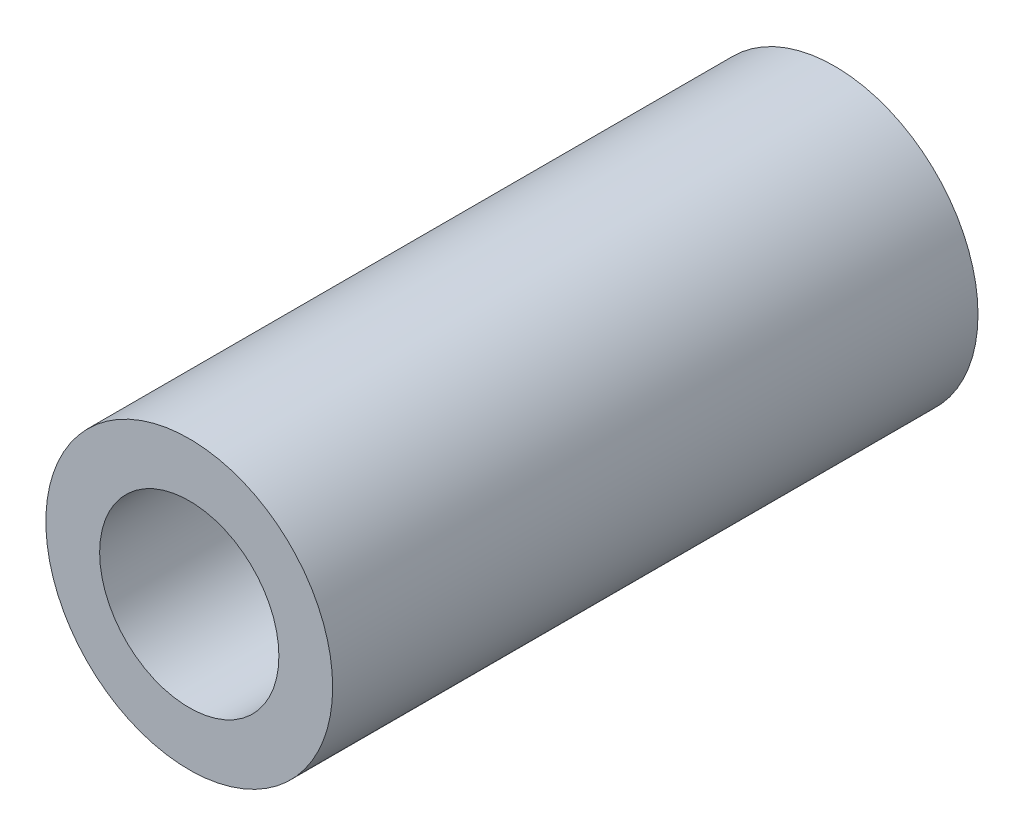
ISO-10303-21;
HEADER;
FILE_DESCRIPTION(('STEP AP214'),'2;1');
FILE_NAME('part.step','',(''),(''),'','','');
FILE_SCHEMA(('AUTOMOTIVE_DESIGN { 1 0 10303 214 1 1 1 1 }'));
ENDSEC;
DATA;
#1=APPLICATION_CONTEXT('core data for automotive mechanical design processes');
#2=APPLICATION_PROTOCOL_DEFINITION('international standard','automotive_design',2000,#1);
#3=PRODUCT_CONTEXT('',#1,'mechanical');
#4=PRODUCT('Part','Part','',(#3));
#5=PRODUCT_RELATED_PRODUCT_CATEGORY('part','',(#4));
#6=PRODUCT_DEFINITION_FORMATION('','',#4);
#7=PRODUCT_DEFINITION_CONTEXT('part definition',#1,'design');
#8=PRODUCT_DEFINITION('design','',#6,#7);
#9=PRODUCT_DEFINITION_SHAPE('','',#8);
#10=(LENGTH_UNIT() NAMED_UNIT(*) SI_UNIT(.MILLI.,.METRE.));
#11=(NAMED_UNIT(*) PLANE_ANGLE_UNIT() SI_UNIT($,.RADIAN.));
#12=(NAMED_UNIT(*) SI_UNIT($,.STERADIAN.) SOLID_ANGLE_UNIT());
#13=UNCERTAINTY_MEASURE_WITH_UNIT(LENGTH_MEASURE(1.E-05),#10,'distance_accuracy_value','');
#14=(GEOMETRIC_REPRESENTATION_CONTEXT(3) GLOBAL_UNCERTAINTY_ASSIGNED_CONTEXT((#13)) GLOBAL_UNIT_ASSIGNED_CONTEXT((#10,
#11,#12)) REPRESENTATION_CONTEXT('',''));
#15=CARTESIAN_POINT('',(0.,0.,0.));
#16=DIRECTION('',(0.,0.,1.));
#17=DIRECTION('',(1.,0.,0.));
#18=AXIS2_PLACEMENT_3D('',#15,#16,#17);
#19=CARTESIAN_POINT('',(0.,0.,18.));
#20=DIRECTION('',(0.,0.,1.));
#21=DIRECTION('',(1.,0.,0.));
#22=AXIS2_PLACEMENT_3D('',#19,#20,#21);
#23=PLANE('',#22);
#24=CARTESIAN_POINT('',(0.,0.,18.));
#25=DIRECTION('',(0.,0.,1.));
#26=DIRECTION('',(1.,0.,0.));
#27=AXIS2_PLACEMENT_3D('',#24,#25,#26);
#28=CIRCLE('',#27,4.);
#29=CARTESIAN_POINT('',(4.,0.,18.));
#30=VERTEX_POINT('',#29);
#31=EDGE_CURVE('E10',#30,#30,#28,.T.);
#32=ORIENTED_EDGE('',*,*,#31,.T.);
#33=EDGE_LOOP('',(#32));
#34=FACE_BOUND('',#33,.T.);
#35=CARTESIAN_POINT('',(0.,0.,18.));
#36=DIRECTION('',(0.,0.,1.));
#37=DIRECTION('',(1.,0.,0.));
#38=AXIS2_PLACEMENT_3D('',#35,#36,#37);
#39=CIRCLE('',#38,2.5);
#40=CARTESIAN_POINT('',(2.5,0.,18.));
#41=VERTEX_POINT('',#40);
#42=EDGE_CURVE('E56',#41,#41,#39,.T.);
#43=ORIENTED_EDGE('',*,*,#42,.F.);
#44=EDGE_LOOP('',(#43));
#45=FACE_BOUND('',#44,.T.);
#46=ADVANCED_FACE('F43',(#34,#45),#23,.T.);
#47=CARTESIAN_POINT('',(0.,0.,0.));
#48=DIRECTION('',(0.,0.,1.));
#49=DIRECTION('',(1.,0.,0.));
#50=AXIS2_PLACEMENT_3D('',#47,#48,#49);
#51=PLANE('',#50);
#52=CARTESIAN_POINT('',(0.,0.,0.));
#53=DIRECTION('',(0.,0.,1.));
#54=DIRECTION('',(1.,0.,0.));
#55=AXIS2_PLACEMENT_3D('',#52,#53,#54);
#56=CIRCLE('',#55,4.);
#57=CARTESIAN_POINT('',(4.,0.,0.));
#58=VERTEX_POINT('',#57);
#59=EDGE_CURVE('E47',#58,#58,#56,.T.);
#60=ORIENTED_EDGE('',*,*,#59,.F.);
#61=EDGE_LOOP('',(#60));
#62=FACE_BOUND('',#61,.T.);
#63=CARTESIAN_POINT('',(0.,0.,0.));
#64=DIRECTION('',(0.,0.,1.));
#65=DIRECTION('',(1.,0.,0.));
#66=AXIS2_PLACEMENT_3D('',#63,#64,#65);
#67=CIRCLE('',#66,2.5);
#68=CARTESIAN_POINT('',(2.5,0.,0.));
#69=VERTEX_POINT('',#68);
#70=EDGE_CURVE('E58',#69,#69,#67,.T.);
#71=ORIENTED_EDGE('',*,*,#70,.T.);
#72=EDGE_LOOP('',(#71));
#73=FACE_BOUND('',#72,.T.);
#74=ADVANCED_FACE('F70',(#62,#73),#51,.F.);
#75=CARTESIAN_POINT('',(0.,0.,18.));
#76=DIRECTION('',(0.,0.,-1.));
#77=DIRECTION('',(-1.,0.,0.));
#78=AXIS2_PLACEMENT_3D('',#75,#76,#77);
#79=CYLINDRICAL_SURFACE('',#78,4.);
#80=ORIENTED_EDGE('',*,*,#31,.F.);
#81=EDGE_LOOP('',(#80));
#82=FACE_BOUND('',#81,.T.);
#83=ORIENTED_EDGE('',*,*,#59,.T.);
#84=EDGE_LOOP('',(#83));
#85=FACE_BOUND('',#84,.T.);
#86=ADVANCED_FACE('F45',(#82,#85),#79,.T.);
#87=CARTESIAN_POINT('',(0.,0.,18.));
#88=DIRECTION('',(0.,0.,-1.));
#89=DIRECTION('',(-1.,0.,0.));
#90=AXIS2_PLACEMENT_3D('',#87,#88,#89);
#91=CYLINDRICAL_SURFACE('',#90,2.5);
#92=ORIENTED_EDGE('',*,*,#42,.T.);
#93=EDGE_LOOP('',(#92));
#94=FACE_BOUND('',#93,.T.);
#95=ORIENTED_EDGE('',*,*,#70,.F.);
#96=EDGE_LOOP('',(#95));
#97=FACE_BOUND('',#96,.T.);
#98=ADVANCED_FACE('F66',(#94,#97),#91,.F.);
#99=CLOSED_SHELL('',(#46,#74,#86,#98));
#100=MANIFOLD_SOLID_BREP('B2',#99);
#101=ADVANCED_BREP_SHAPE_REPRESENTATION('',(#18,#100),#14);
#102=SHAPE_DEFINITION_REPRESENTATION(#9,#101);
ENDSEC;
END-ISO-10303-21;
